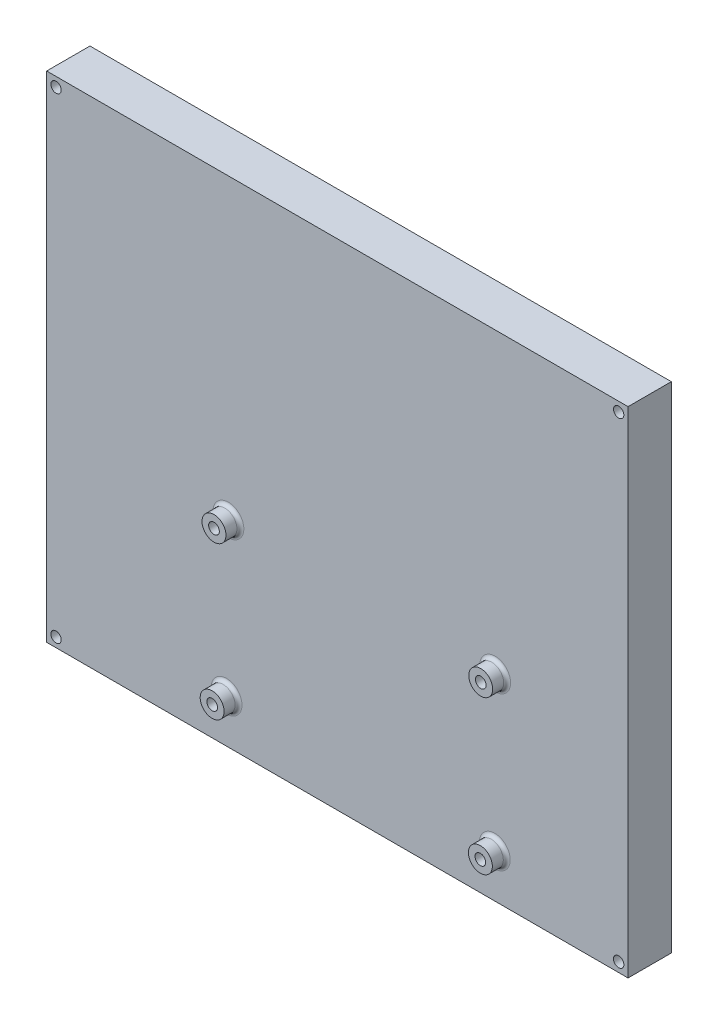
ISO-10303-21;
HEADER;
FILE_DESCRIPTION(('STEP AP214'),'2;1');
FILE_NAME('part.step','',(''),(''),'','','');
FILE_SCHEMA(('AUTOMOTIVE_DESIGN { 1 0 10303 214 1 1 1 1 }'));
ENDSEC;
DATA;
#1=APPLICATION_CONTEXT('core data for automotive mechanical design processes');
#2=APPLICATION_PROTOCOL_DEFINITION('international standard','automotive_design',2000,#1);
#3=PRODUCT_CONTEXT('',#1,'mechanical');
#4=PRODUCT('Part','Part','',(#3));
#5=PRODUCT_RELATED_PRODUCT_CATEGORY('part','',(#4));
#6=PRODUCT_DEFINITION_FORMATION('','',#4);
#7=PRODUCT_DEFINITION_CONTEXT('part definition',#1,'design');
#8=PRODUCT_DEFINITION('design','',#6,#7);
#9=PRODUCT_DEFINITION_SHAPE('','',#8);
#10=(LENGTH_UNIT() NAMED_UNIT(*) SI_UNIT(.MILLI.,.METRE.));
#11=(NAMED_UNIT(*) PLANE_ANGLE_UNIT() SI_UNIT($,.RADIAN.));
#12=(NAMED_UNIT(*) SI_UNIT($,.STERADIAN.) SOLID_ANGLE_UNIT());
#13=UNCERTAINTY_MEASURE_WITH_UNIT(LENGTH_MEASURE(1.E-05),#10,'distance_accuracy_value','');
#14=(GEOMETRIC_REPRESENTATION_CONTEXT(3) GLOBAL_UNCERTAINTY_ASSIGNED_CONTEXT((#13)) GLOBAL_UNIT_ASSIGNED_CONTEXT((#10,
#11,#12)) REPRESENTATION_CONTEXT('',''));
#15=CARTESIAN_POINT('',(0.,0.,0.));
#16=DIRECTION('',(0.,0.,1.));
#17=DIRECTION('',(1.,0.,0.));
#18=AXIS2_PLACEMENT_3D('',#15,#16,#17);
#19=CARTESIAN_POINT('',(100.75,85.75,15.));
#20=DIRECTION('',(-1.,0.,0.));
#21=DIRECTION('',(0.,-1.,0.));
#22=AXIS2_PLACEMENT_3D('',#19,#20,#21);
#23=PLANE('',#22);
#24=DIRECTION('',(0.,1.,0.));
#25=VECTOR('',#24,1.);
#26=CARTESIAN_POINT('',(100.75,85.75,0.));
#27=LINE('',#26,#25);
#28=CARTESIAN_POINT('',(100.75,-85.75,0.));
#29=VERTEX_POINT('',#28);
#30=CARTESIAN_POINT('',(100.75,85.75,0.));
#31=VERTEX_POINT('',#30);
#32=EDGE_CURVE('E266',#29,#31,#27,.T.);
#33=ORIENTED_EDGE('',*,*,#32,.T.);
#34=DIRECTION('',(0.,0.,-1.));
#35=VECTOR('',#34,1.);
#36=CARTESIAN_POINT('',(100.75,85.75,15.));
#37=LINE('',#36,#35);
#38=CARTESIAN_POINT('',(100.75,85.75,15.));
#39=VERTEX_POINT('',#38);
#40=EDGE_CURVE('E301',#39,#31,#37,.T.);
#41=ORIENTED_EDGE('',*,*,#40,.F.);
#42=DIRECTION('',(0.,1.,0.));
#43=VECTOR('',#42,1.);
#44=CARTESIAN_POINT('',(100.75,85.75,15.));
#45=LINE('',#44,#43);
#46=CARTESIAN_POINT('',(100.75,-85.75,15.));
#47=VERTEX_POINT('',#46);
#48=EDGE_CURVE('E270',#47,#39,#45,.T.);
#49=ORIENTED_EDGE('',*,*,#48,.F.);
#50=DIRECTION('',(0.,0.,-1.));
#51=VECTOR('',#50,1.);
#52=CARTESIAN_POINT('',(100.75,-85.75,15.));
#53=LINE('',#52,#51);
#54=EDGE_CURVE('E280',#47,#29,#53,.T.);
#55=ORIENTED_EDGE('',*,*,#54,.T.);
#56=EDGE_LOOP('',(#33,#41,#49,#55));
#57=FACE_BOUND('',#56,.T.);
#58=ADVANCED_FACE('F75',(#57),#23,.F.);
#59=CARTESIAN_POINT('',(-100.75,85.75,15.));
#60=DIRECTION('',(0.,-1.,0.));
#61=DIRECTION('',(0.,0.,-1.));
#62=AXIS2_PLACEMENT_3D('',#59,#60,#61);
#63=PLANE('',#62);
#64=DIRECTION('',(-1.,0.,0.));
#65=VECTOR('',#64,1.);
#66=CARTESIAN_POINT('',(-100.75,85.75,0.));
#67=LINE('',#66,#65);
#68=CARTESIAN_POINT('',(-100.75,85.75,0.));
#69=VERTEX_POINT('',#68);
#70=EDGE_CURVE('E284',#31,#69,#67,.T.);
#71=ORIENTED_EDGE('',*,*,#70,.T.);
#72=DIRECTION('',(0.,0.,-1.));
#73=VECTOR('',#72,1.);
#74=CARTESIAN_POINT('',(-100.75,85.75,15.));
#75=LINE('',#74,#73);
#76=CARTESIAN_POINT('',(-100.75,85.75,15.));
#77=VERTEX_POINT('',#76);
#78=EDGE_CURVE('E297',#77,#69,#75,.T.);
#79=ORIENTED_EDGE('',*,*,#78,.F.);
#80=DIRECTION('',(-1.,0.,0.));
#81=VECTOR('',#80,1.);
#82=CARTESIAN_POINT('',(-100.75,85.75,15.));
#83=LINE('',#82,#81);
#84=EDGE_CURVE('E129',#39,#77,#83,.T.);
#85=ORIENTED_EDGE('',*,*,#84,.F.);
#86=ORIENTED_EDGE('',*,*,#40,.T.);
#87=EDGE_LOOP('',(#71,#79,#85,#86));
#88=FACE_BOUND('',#87,.T.);
#89=ADVANCED_FACE('F349',(#88),#63,.F.);
#90=CARTESIAN_POINT('',(-100.75,85.75,15.));
#91=DIRECTION('',(1.,0.,0.));
#92=DIRECTION('',(0.,1.,0.));
#93=AXIS2_PLACEMENT_3D('',#90,#91,#92);
#94=PLANE('',#93);
#95=DIRECTION('',(0.,-1.,0.));
#96=VECTOR('',#95,1.);
#97=CARTESIAN_POINT('',(-100.75,85.75,0.));
#98=LINE('',#97,#96);
#99=CARTESIAN_POINT('',(-100.75,-85.75,0.));
#100=VERTEX_POINT('',#99);
#101=EDGE_CURVE('E287',#69,#100,#98,.T.);
#102=ORIENTED_EDGE('',*,*,#101,.T.);
#103=DIRECTION('',(0.,0.,-1.));
#104=VECTOR('',#103,1.);
#105=CARTESIAN_POINT('',(-100.75,-85.75,15.));
#106=LINE('',#105,#104);
#107=CARTESIAN_POINT('',(-100.75,-85.75,15.));
#108=VERTEX_POINT('',#107);
#109=EDGE_CURVE('E294',#108,#100,#106,.T.);
#110=ORIENTED_EDGE('',*,*,#109,.F.);
#111=DIRECTION('',(0.,-1.,0.));
#112=VECTOR('',#111,1.);
#113=CARTESIAN_POINT('',(-100.75,85.75,15.));
#114=LINE('',#113,#112);
#115=EDGE_CURVE('E275',#77,#108,#114,.T.);
#116=ORIENTED_EDGE('',*,*,#115,.F.);
#117=ORIENTED_EDGE('',*,*,#78,.T.);
#118=EDGE_LOOP('',(#102,#110,#116,#117));
#119=FACE_BOUND('',#118,.T.);
#120=ADVANCED_FACE('F354',(#119),#94,.F.);
#121=CARTESIAN_POINT('',(-100.75,-85.75,15.));
#122=DIRECTION('',(0.,1.,0.));
#123=DIRECTION('',(0.,0.,1.));
#124=AXIS2_PLACEMENT_3D('',#121,#122,#123);
#125=PLANE('',#124);
#126=DIRECTION('',(1.,0.,0.));
#127=VECTOR('',#126,1.);
#128=CARTESIAN_POINT('',(-100.75,-85.75,0.));
#129=LINE('',#128,#127);
#130=EDGE_CURVE('E121',#100,#29,#129,.T.);
#131=ORIENTED_EDGE('',*,*,#130,.T.);
#132=ORIENTED_EDGE('',*,*,#54,.F.);
#133=DIRECTION('',(1.,0.,0.));
#134=VECTOR('',#133,1.);
#135=CARTESIAN_POINT('',(-100.75,-85.75,15.));
#136=LINE('',#135,#134);
#137=EDGE_CURVE('E100',#108,#47,#136,.T.);
#138=ORIENTED_EDGE('',*,*,#137,.F.);
#139=ORIENTED_EDGE('',*,*,#109,.T.);
#140=EDGE_LOOP('',(#131,#132,#138,#139));
#141=FACE_BOUND('',#140,.T.);
#142=ADVANCED_FACE('F458',(#141),#125,.F.);
#143=CARTESIAN_POINT('',(0.,0.,15.));
#144=DIRECTION('',(0.,0.,1.));
#145=DIRECTION('',(1.,0.,0.));
#146=AXIS2_PLACEMENT_3D('',#143,#144,#145);
#147=PLANE('',#146);
#148=CARTESIAN_POINT('',(-38.3989992,-70.7475021000001,15.));
#149=DIRECTION('',(0.,0.,1.));
#150=DIRECTION('',(1.,0.,0.));
#151=AXIS2_PLACEMENT_3D('',#148,#149,#150);
#152=CIRCLE('',#151,5.35);
#153=CARTESIAN_POINT('',(-33.0489992,-70.7475021000001,15.));
#154=VERTEX_POINT('',#153);
#155=EDGE_CURVE('E320',#154,#154,#152,.F.);
#156=ORIENTED_EDGE('',*,*,#155,.T.);
#157=EDGE_LOOP('',(#156));
#158=FACE_BOUND('',#157,.T.);
#159=CARTESIAN_POINT('',(54.5650008,-70.7475021000001,15.));
#160=DIRECTION('',(0.,0.,1.));
#161=DIRECTION('',(1.,0.,0.));
#162=AXIS2_PLACEMENT_3D('',#159,#160,#161);
#163=CIRCLE('',#162,5.35);
#164=CARTESIAN_POINT('',(59.9150008,-70.7475021000001,15.));
#165=VERTEX_POINT('',#164);
#166=EDGE_CURVE('E316',#165,#165,#163,.F.);
#167=ORIENTED_EDGE('',*,*,#166,.T.);
#168=EDGE_LOOP('',(#167));
#169=FACE_BOUND('',#168,.T.);
#170=CARTESIAN_POINT('',(54.6920008,-17.5345021000001,15.));
#171=DIRECTION('',(0.,0.,1.));
#172=DIRECTION('',(1.,0.,0.));
#173=AXIS2_PLACEMENT_3D('',#170,#171,#172);
#174=CIRCLE('',#173,5.35);
#175=CARTESIAN_POINT('',(60.0420008,-17.5345021000001,15.));
#176=VERTEX_POINT('',#175);
#177=EDGE_CURVE('E312',#176,#176,#174,.F.);
#178=ORIENTED_EDGE('',*,*,#177,.T.);
#179=EDGE_LOOP('',(#178));
#180=FACE_BOUND('',#179,.T.);
#181=CARTESIAN_POINT('',(-37.7639992,-17.5345021000001,15.));
#182=DIRECTION('',(0.,0.,1.));
#183=DIRECTION('',(1.,0.,0.));
#184=AXIS2_PLACEMENT_3D('',#181,#182,#183);
#185=CIRCLE('',#184,5.35);
#186=CARTESIAN_POINT('',(-32.4139992,-17.5345021000001,15.));
#187=VERTEX_POINT('',#186);
#188=EDGE_CURVE('E308',#187,#187,#185,.F.);
#189=ORIENTED_EDGE('',*,*,#188,.T.);
#190=EDGE_LOOP('',(#189));
#191=FACE_BOUND('',#190,.T.);
#192=CARTESIAN_POINT('',(97.5,-82.5,15.));
#193=DIRECTION('',(0.,0.,1.));
#194=DIRECTION('',(1.,0.,0.));
#195=AXIS2_PLACEMENT_3D('',#192,#193,#194);
#196=CIRCLE('',#195,1.79999999999999);
#197=CARTESIAN_POINT('',(99.3,-82.5,15.));
#198=VERTEX_POINT('',#197);
#199=EDGE_CURVE('E255',#198,#198,#196,.T.);
#200=ORIENTED_EDGE('',*,*,#199,.F.);
#201=EDGE_LOOP('',(#200));
#202=FACE_BOUND('',#201,.T.);
#203=CARTESIAN_POINT('',(-97.5,-82.5,15.));
#204=DIRECTION('',(0.,0.,1.));
#205=DIRECTION('',(1.,0.,0.));
#206=AXIS2_PLACEMENT_3D('',#203,#204,#205);
#207=CIRCLE('',#206,1.79999999999999);
#208=CARTESIAN_POINT('',(-95.7,-82.5,15.));
#209=VERTEX_POINT('',#208);
#210=EDGE_CURVE('E247',#209,#209,#207,.T.);
#211=ORIENTED_EDGE('',*,*,#210,.F.);
#212=EDGE_LOOP('',(#211));
#213=FACE_BOUND('',#212,.T.);
#214=CARTESIAN_POINT('',(-97.5,82.5,15.));
#215=DIRECTION('',(0.,0.,1.));
#216=DIRECTION('',(1.,0.,0.));
#217=AXIS2_PLACEMENT_3D('',#214,#215,#216);
#218=CIRCLE('',#217,1.79999999999999);
#219=CARTESIAN_POINT('',(-95.7,82.5,15.));
#220=VERTEX_POINT('',#219);
#221=EDGE_CURVE('E238',#220,#220,#218,.T.);
#222=ORIENTED_EDGE('',*,*,#221,.F.);
#223=EDGE_LOOP('',(#222));
#224=FACE_BOUND('',#223,.T.);
#225=CARTESIAN_POINT('',(97.5,82.5,15.));
#226=DIRECTION('',(0.,0.,1.));
#227=DIRECTION('',(1.,0.,0.));
#228=AXIS2_PLACEMENT_3D('',#225,#226,#227);
#229=CIRCLE('',#228,1.79999999999999);
#230=CARTESIAN_POINT('',(99.3,82.5,15.));
#231=VERTEX_POINT('',#230);
#232=EDGE_CURVE('E242',#231,#231,#229,.T.);
#233=ORIENTED_EDGE('',*,*,#232,.F.);
#234=EDGE_LOOP('',(#233));
#235=FACE_BOUND('',#234,.T.);
#236=ORIENTED_EDGE('',*,*,#48,.T.);
#237=ORIENTED_EDGE('',*,*,#84,.T.);
#238=ORIENTED_EDGE('',*,*,#115,.T.);
#239=ORIENTED_EDGE('',*,*,#137,.T.);
#240=EDGE_LOOP('',(#236,#237,#238,#239));
#241=FACE_BOUND('',#240,.T.);
#242=ADVANCED_FACE('F455',(#158,#169,#180,#191,#202,#213,#224,#235,#241),#147,.T.);
#243=CARTESIAN_POINT('',(0.,0.,0.));
#244=DIRECTION('',(0.,0.,1.));
#245=DIRECTION('',(1.,0.,0.));
#246=AXIS2_PLACEMENT_3D('',#243,#244,#245);
#247=PLANE('',#246);
#248=DIRECTION('',(1.,0.,0.));
#249=VECTOR('',#248,1.);
#250=CARTESIAN_POINT('',(90.,75.,0.));
#251=LINE('',#250,#249);
#252=CARTESIAN_POINT('',(-90.,75.,0.));
#253=VERTEX_POINT('',#252);
#254=CARTESIAN_POINT('',(90.,75.,0.));
#255=VERTEX_POINT('',#254);
#256=EDGE_CURVE('E191',#253,#255,#251,.T.);
#257=ORIENTED_EDGE('',*,*,#256,.F.);
#258=DIRECTION('',(0.,1.,0.));
#259=VECTOR('',#258,1.);
#260=CARTESIAN_POINT('',(-90.,75.,0.));
#261=LINE('',#260,#259);
#262=CARTESIAN_POINT('',(-90.,-75.,0.));
#263=VERTEX_POINT('',#262);
#264=EDGE_CURVE('E91',#263,#253,#261,.T.);
#265=ORIENTED_EDGE('',*,*,#264,.F.);
#266=DIRECTION('',(-1.,0.,0.));
#267=VECTOR('',#266,1.);
#268=CARTESIAN_POINT('',(90.,-75.,0.));
#269=LINE('',#268,#267);
#270=CARTESIAN_POINT('',(90.,-75.,0.));
#271=VERTEX_POINT('',#270);
#272=EDGE_CURVE('E174',#271,#263,#269,.T.);
#273=ORIENTED_EDGE('',*,*,#272,.F.);
#274=DIRECTION('',(0.,-1.,0.));
#275=VECTOR('',#274,1.);
#276=CARTESIAN_POINT('',(90.,75.,0.));
#277=LINE('',#276,#275);
#278=EDGE_CURVE('E179',#255,#271,#277,.T.);
#279=ORIENTED_EDGE('',*,*,#278,.F.);
#280=EDGE_LOOP('',(#257,#265,#273,#279));
#281=FACE_BOUND('',#280,.T.);
#282=CARTESIAN_POINT('',(97.5,-82.5,0.));
#283=DIRECTION('',(0.,0.,1.));
#284=DIRECTION('',(1.,0.,0.));
#285=AXIS2_PLACEMENT_3D('',#282,#283,#284);
#286=CIRCLE('',#285,1.79999999999999);
#287=CARTESIAN_POINT('',(99.3,-82.5,0.));
#288=VERTEX_POINT('',#287);
#289=EDGE_CURVE('E237',#288,#288,#286,.T.);
#290=ORIENTED_EDGE('',*,*,#289,.T.);
#291=EDGE_LOOP('',(#290));
#292=FACE_BOUND('',#291,.T.);
#293=CARTESIAN_POINT('',(-97.5,-82.5,0.));
#294=DIRECTION('',(0.,0.,1.));
#295=DIRECTION('',(1.,0.,0.));
#296=AXIS2_PLACEMENT_3D('',#293,#294,#295);
#297=CIRCLE('',#296,1.79999999999999);
#298=CARTESIAN_POINT('',(-95.7,-82.5,0.));
#299=VERTEX_POINT('',#298);
#300=EDGE_CURVE('E251',#299,#299,#297,.T.);
#301=ORIENTED_EDGE('',*,*,#300,.T.);
#302=EDGE_LOOP('',(#301));
#303=FACE_BOUND('',#302,.T.);
#304=CARTESIAN_POINT('',(-97.5,82.5,0.));
#305=DIRECTION('',(0.,0.,1.));
#306=DIRECTION('',(1.,0.,0.));
#307=AXIS2_PLACEMENT_3D('',#304,#305,#306);
#308=CIRCLE('',#307,1.79999999999999);
#309=CARTESIAN_POINT('',(-95.7,82.5,0.));
#310=VERTEX_POINT('',#309);
#311=EDGE_CURVE('E243',#310,#310,#308,.T.);
#312=ORIENTED_EDGE('',*,*,#311,.T.);
#313=EDGE_LOOP('',(#312));
#314=FACE_BOUND('',#313,.T.);
#315=CARTESIAN_POINT('',(97.5,82.5,0.));
#316=DIRECTION('',(0.,0.,1.));
#317=DIRECTION('',(1.,0.,0.));
#318=AXIS2_PLACEMENT_3D('',#315,#316,#317);
#319=CIRCLE('',#318,1.79999999999999);
#320=CARTESIAN_POINT('',(99.3,82.5,0.));
#321=VERTEX_POINT('',#320);
#322=EDGE_CURVE('E262',#321,#321,#319,.T.);
#323=ORIENTED_EDGE('',*,*,#322,.T.);
#324=EDGE_LOOP('',(#323));
#325=FACE_BOUND('',#324,.T.);
#326=ORIENTED_EDGE('',*,*,#32,.F.);
#327=ORIENTED_EDGE('',*,*,#130,.F.);
#328=ORIENTED_EDGE('',*,*,#101,.F.);
#329=ORIENTED_EDGE('',*,*,#70,.F.);
#330=EDGE_LOOP('',(#326,#327,#328,#329));
#331=FACE_BOUND('',#330,.T.);
#332=ADVANCED_FACE('F453',(#281,#292,#303,#314,#325,#331),#247,.F.);
#333=CARTESIAN_POINT('',(97.5,82.5,0.));
#334=DIRECTION('',(0.,0.,1.));
#335=DIRECTION('',(1.,0.,0.));
#336=AXIS2_PLACEMENT_3D('',#333,#334,#335);
#337=CYLINDRICAL_SURFACE('',#336,1.79999999999999);
#338=ORIENTED_EDGE('',*,*,#322,.F.);
#339=EDGE_LOOP('',(#338));
#340=FACE_BOUND('',#339,.T.);
#341=ORIENTED_EDGE('',*,*,#232,.T.);
#342=EDGE_LOOP('',(#341));
#343=FACE_BOUND('',#342,.T.);
#344=ADVANCED_FACE('F443',(#340,#343),#337,.F.);
#345=CARTESIAN_POINT('',(-97.5,82.5,0.));
#346=DIRECTION('',(0.,0.,1.));
#347=DIRECTION('',(1.,0.,0.));
#348=AXIS2_PLACEMENT_3D('',#345,#346,#347);
#349=CYLINDRICAL_SURFACE('',#348,1.79999999999999);
#350=ORIENTED_EDGE('',*,*,#311,.F.);
#351=EDGE_LOOP('',(#350));
#352=FACE_BOUND('',#351,.T.);
#353=ORIENTED_EDGE('',*,*,#221,.T.);
#354=EDGE_LOOP('',(#353));
#355=FACE_BOUND('',#354,.T.);
#356=ADVANCED_FACE('F439',(#352,#355),#349,.F.);
#357=CARTESIAN_POINT('',(-97.5,-82.5,0.));
#358=DIRECTION('',(0.,0.,1.));
#359=DIRECTION('',(1.,0.,0.));
#360=AXIS2_PLACEMENT_3D('',#357,#358,#359);
#361=CYLINDRICAL_SURFACE('',#360,1.79999999999999);
#362=ORIENTED_EDGE('',*,*,#300,.F.);
#363=EDGE_LOOP('',(#362));
#364=FACE_BOUND('',#363,.T.);
#365=ORIENTED_EDGE('',*,*,#210,.T.);
#366=EDGE_LOOP('',(#365));
#367=FACE_BOUND('',#366,.T.);
#368=ADVANCED_FACE('F442',(#364,#367),#361,.F.);
#369=CARTESIAN_POINT('',(97.5,-82.5,0.));
#370=DIRECTION('',(0.,0.,1.));
#371=DIRECTION('',(1.,0.,0.));
#372=AXIS2_PLACEMENT_3D('',#369,#370,#371);
#373=CYLINDRICAL_SURFACE('',#372,1.79999999999999);
#374=ORIENTED_EDGE('',*,*,#289,.F.);
#375=EDGE_LOOP('',(#374));
#376=FACE_BOUND('',#375,.T.);
#377=ORIENTED_EDGE('',*,*,#199,.T.);
#378=EDGE_LOOP('',(#377));
#379=FACE_BOUND('',#378,.T.);
#380=ADVANCED_FACE('F434',(#376,#379),#373,.F.);
#381=CARTESIAN_POINT('',(-37.7639992,-17.5345021000001,20.));
#382=DIRECTION('',(0.,0.,1.));
#383=DIRECTION('',(1.,0.,0.));
#384=AXIS2_PLACEMENT_3D('',#381,#382,#383);
#385=PLANE('',#384);
#386=CARTESIAN_POINT('',(-37.7639992,-17.5345021000001,20.));
#387=DIRECTION('',(0.,0.,1.));
#388=DIRECTION('',(1.,0.,0.));
#389=AXIS2_PLACEMENT_3D('',#386,#387,#388);
#390=CIRCLE('',#389,4.15);
#391=CARTESIAN_POINT('',(-33.6139992,-17.5345021000001,20.));
#392=VERTEX_POINT('',#391);
#393=EDGE_CURVE('E233',#392,#392,#390,.T.);
#394=ORIENTED_EDGE('',*,*,#393,.T.);
#395=EDGE_LOOP('',(#394));
#396=FACE_BOUND('',#395,.T.);
#397=CARTESIAN_POINT('',(-37.7639992,-17.5345021000001,20.));
#398=DIRECTION('',(0.,0.,1.));
#399=DIRECTION('',(1.,0.,0.));
#400=AXIS2_PLACEMENT_3D('',#397,#398,#399);
#401=CIRCLE('',#400,1.85);
#402=CARTESIAN_POINT('',(-35.9139992,-17.5345021000001,20.));
#403=VERTEX_POINT('',#402);
#404=EDGE_CURVE('E215',#403,#403,#401,.T.);
#405=ORIENTED_EDGE('',*,*,#404,.F.);
#406=EDGE_LOOP('',(#405));
#407=FACE_BOUND('',#406,.T.);
#408=ADVANCED_FACE('F431',(#396,#407),#385,.T.);
#409=CARTESIAN_POINT('',(-37.7639992,-17.5345021000001,20.));
#410=DIRECTION('',(0.,0.,-1.));
#411=DIRECTION('',(-1.,0.,0.));
#412=AXIS2_PLACEMENT_3D('',#409,#410,#411);
#413=CYLINDRICAL_SURFACE('',#412,4.15);
#414=CARTESIAN_POINT('',(-37.7639992,-17.5345021000001,16.2));
#415=DIRECTION('',(0.,0.,1.));
#416=DIRECTION('',(1.,0.,0.));
#417=AXIS2_PLACEMENT_3D('',#414,#415,#416);
#418=CIRCLE('',#417,4.15);
#419=CARTESIAN_POINT('',(-33.6139992,-17.5345021000001,16.2));
#420=VERTEX_POINT('',#419);
#421=EDGE_CURVE('E12',#420,#420,#418,.T.);
#422=ORIENTED_EDGE('',*,*,#421,.T.);
#423=EDGE_LOOP('',(#422));
#424=FACE_BOUND('',#423,.T.);
#425=ORIENTED_EDGE('',*,*,#393,.F.);
#426=EDGE_LOOP('',(#425));
#427=FACE_BOUND('',#426,.T.);
#428=ADVANCED_FACE('F429',(#424,#427),#413,.T.);
#429=CARTESIAN_POINT('',(-37.7639992,-17.5345021000001,20.));
#430=DIRECTION('',(0.,0.,-1.));
#431=DIRECTION('',(-1.,0.,0.));
#432=AXIS2_PLACEMENT_3D('',#429,#430,#431);
#433=CYLINDRICAL_SURFACE('',#432,1.85);
#434=ORIENTED_EDGE('',*,*,#404,.T.);
#435=EDGE_LOOP('',(#434));
#436=FACE_BOUND('',#435,.T.);
#437=CARTESIAN_POINT('',(-37.7639992,-17.5345021000001,13.));
#438=DIRECTION('',(0.,0.,1.));
#439=DIRECTION('',(1.,0.,0.));
#440=AXIS2_PLACEMENT_3D('',#437,#438,#439);
#441=CIRCLE('',#440,1.85);
#442=CARTESIAN_POINT('',(-35.9139992,-17.5345021000001,13.));
#443=VERTEX_POINT('',#442);
#444=EDGE_CURVE('E182',#443,#443,#441,.T.);
#445=ORIENTED_EDGE('',*,*,#444,.F.);
#446=EDGE_LOOP('',(#445));
#447=FACE_BOUND('',#446,.T.);
#448=ADVANCED_FACE('F426',(#436,#447),#433,.F.);
#449=CARTESIAN_POINT('',(54.6920008,-17.5345021000001,20.));
#450=DIRECTION('',(0.,0.,1.));
#451=DIRECTION('',(1.,0.,0.));
#452=AXIS2_PLACEMENT_3D('',#449,#450,#451);
#453=PLANE('',#452);
#454=CARTESIAN_POINT('',(54.6920008,-17.5345021000001,20.));
#455=DIRECTION('',(0.,0.,1.));
#456=DIRECTION('',(1.,0.,0.));
#457=AXIS2_PLACEMENT_3D('',#454,#455,#456);
#458=CIRCLE('',#457,4.15);
#459=CARTESIAN_POINT('',(58.8420008,-17.5345021000001,20.));
#460=VERTEX_POINT('',#459);
#461=EDGE_CURVE('E206',#460,#460,#458,.T.);
#462=ORIENTED_EDGE('',*,*,#461,.T.);
#463=EDGE_LOOP('',(#462));
#464=FACE_BOUND('',#463,.T.);
#465=CARTESIAN_POINT('',(54.6920008,-17.5345021000001,20.));
#466=DIRECTION('',(0.,0.,1.));
#467=DIRECTION('',(1.,0.,0.));
#468=AXIS2_PLACEMENT_3D('',#465,#466,#467);
#469=CIRCLE('',#468,1.85);
#470=CARTESIAN_POINT('',(56.5420008,-17.5345021000001,20.));
#471=VERTEX_POINT('',#470);
#472=EDGE_CURVE('E210',#471,#471,#469,.T.);
#473=ORIENTED_EDGE('',*,*,#472,.F.);
#474=EDGE_LOOP('',(#473));
#475=FACE_BOUND('',#474,.T.);
#476=ADVANCED_FACE('F416',(#464,#475),#453,.T.);
#477=CARTESIAN_POINT('',(54.6920008,-17.5345021000001,20.));
#478=DIRECTION('',(0.,0.,-1.));
#479=DIRECTION('',(-1.,0.,0.));
#480=AXIS2_PLACEMENT_3D('',#477,#478,#479);
#481=CYLINDRICAL_SURFACE('',#480,4.15);
#482=CARTESIAN_POINT('',(54.6920008,-17.5345021000001,16.2));
#483=DIRECTION('',(0.,0.,1.));
#484=DIRECTION('',(1.,0.,0.));
#485=AXIS2_PLACEMENT_3D('',#482,#483,#484);
#486=CIRCLE('',#485,4.15);
#487=CARTESIAN_POINT('',(58.8420008,-17.5345021000001,16.2));
#488=VERTEX_POINT('',#487);
#489=EDGE_CURVE('E84',#488,#488,#486,.T.);
#490=ORIENTED_EDGE('',*,*,#489,.T.);
#491=EDGE_LOOP('',(#490));
#492=FACE_BOUND('',#491,.T.);
#493=ORIENTED_EDGE('',*,*,#461,.F.);
#494=EDGE_LOOP('',(#493));
#495=FACE_BOUND('',#494,.T.);
#496=ADVANCED_FACE('F332',(#492,#495),#481,.T.);
#497=CARTESIAN_POINT('',(54.6920008,-17.5345021000001,20.));
#498=DIRECTION('',(0.,0.,-1.));
#499=DIRECTION('',(-1.,0.,0.));
#500=AXIS2_PLACEMENT_3D('',#497,#498,#499);
#501=CYLINDRICAL_SURFACE('',#500,1.85);
#502=ORIENTED_EDGE('',*,*,#472,.T.);
#503=EDGE_LOOP('',(#502));
#504=FACE_BOUND('',#503,.T.);
#505=CARTESIAN_POINT('',(54.6920008,-17.5345021000001,13.));
#506=DIRECTION('',(0.,0.,1.));
#507=DIRECTION('',(1.,0.,0.));
#508=AXIS2_PLACEMENT_3D('',#505,#506,#507);
#509=CIRCLE('',#508,1.85);
#510=CARTESIAN_POINT('',(56.5420008,-17.5345021000001,13.));
#511=VERTEX_POINT('',#510);
#512=EDGE_CURVE('E396',#511,#511,#509,.T.);
#513=ORIENTED_EDGE('',*,*,#512,.F.);
#514=EDGE_LOOP('',(#513));
#515=FACE_BOUND('',#514,.T.);
#516=ADVANCED_FACE('F405',(#504,#515),#501,.F.);
#517=CARTESIAN_POINT('',(54.5650008,-70.7475021000001,20.));
#518=DIRECTION('',(0.,0.,1.));
#519=DIRECTION('',(1.,0.,0.));
#520=AXIS2_PLACEMENT_3D('',#517,#518,#519);
#521=PLANE('',#520);
#522=CARTESIAN_POINT('',(54.5650008,-70.7475021000001,20.));
#523=DIRECTION('',(0.,0.,1.));
#524=DIRECTION('',(1.,0.,0.));
#525=AXIS2_PLACEMENT_3D('',#522,#523,#524);
#526=CIRCLE('',#525,4.15);
#527=CARTESIAN_POINT('',(58.7150008,-70.7475021000001,20.));
#528=VERTEX_POINT('',#527);
#529=EDGE_CURVE('E216',#528,#528,#526,.T.);
#530=ORIENTED_EDGE('',*,*,#529,.T.);
#531=EDGE_LOOP('',(#530));
#532=FACE_BOUND('',#531,.T.);
#533=CARTESIAN_POINT('',(54.5650008,-70.7475021000001,20.));
#534=DIRECTION('',(0.,0.,1.));
#535=DIRECTION('',(1.,0.,0.));
#536=AXIS2_PLACEMENT_3D('',#533,#534,#535);
#537=CIRCLE('',#536,1.85);
#538=CARTESIAN_POINT('',(56.4150008,-70.7475021000001,20.));
#539=VERTEX_POINT('',#538);
#540=EDGE_CURVE('E211',#539,#539,#537,.T.);
#541=ORIENTED_EDGE('',*,*,#540,.F.);
#542=EDGE_LOOP('',(#541));
#543=FACE_BOUND('',#542,.T.);
#544=ADVANCED_FACE('F407',(#532,#543),#521,.T.);
#545=CARTESIAN_POINT('',(54.5650008,-70.7475021000001,20.));
#546=DIRECTION('',(0.,0.,-1.));
#547=DIRECTION('',(-1.,0.,0.));
#548=AXIS2_PLACEMENT_3D('',#545,#546,#547);
#549=CYLINDRICAL_SURFACE('',#548,4.15);
#550=CARTESIAN_POINT('',(54.5650008,-70.7475021000001,16.2));
#551=DIRECTION('',(0.,0.,1.));
#552=DIRECTION('',(1.,0.,0.));
#553=AXIS2_PLACEMENT_3D('',#550,#551,#552);
#554=CIRCLE('',#553,4.15);
#555=CARTESIAN_POINT('',(58.7150008,-70.7475021000001,16.2));
#556=VERTEX_POINT('',#555);
#557=EDGE_CURVE('E324',#556,#556,#554,.T.);
#558=ORIENTED_EDGE('',*,*,#557,.T.);
#559=EDGE_LOOP('',(#558));
#560=FACE_BOUND('',#559,.T.);
#561=ORIENTED_EDGE('',*,*,#529,.F.);
#562=EDGE_LOOP('',(#561));
#563=FACE_BOUND('',#562,.T.);
#564=ADVANCED_FACE('F413',(#560,#563),#549,.T.);
#565=CARTESIAN_POINT('',(54.5650008,-70.7475021000001,20.));
#566=DIRECTION('',(0.,0.,-1.));
#567=DIRECTION('',(-1.,0.,0.));
#568=AXIS2_PLACEMENT_3D('',#565,#566,#567);
#569=CYLINDRICAL_SURFACE('',#568,1.85);
#570=ORIENTED_EDGE('',*,*,#540,.T.);
#571=EDGE_LOOP('',(#570));
#572=FACE_BOUND('',#571,.T.);
#573=CARTESIAN_POINT('',(54.5650008,-70.7475021000001,13.));
#574=DIRECTION('',(0.,0.,1.));
#575=DIRECTION('',(1.,0.,0.));
#576=AXIS2_PLACEMENT_3D('',#573,#574,#575);
#577=CIRCLE('',#576,1.84999999999999);
#578=CARTESIAN_POINT('',(56.4150008,-70.7475021000001,13.));
#579=VERTEX_POINT('',#578);
#580=EDGE_CURVE('E389',#579,#579,#577,.T.);
#581=ORIENTED_EDGE('',*,*,#580,.F.);
#582=EDGE_LOOP('',(#581));
#583=FACE_BOUND('',#582,.T.);
#584=ADVANCED_FACE('F377',(#572,#583),#569,.F.);
#585=CARTESIAN_POINT('',(-38.3989992,-70.7475021000001,20.));
#586=DIRECTION('',(0.,0.,1.));
#587=DIRECTION('',(1.,0.,0.));
#588=AXIS2_PLACEMENT_3D('',#585,#586,#587);
#589=PLANE('',#588);
#590=CARTESIAN_POINT('',(-38.3989992,-70.7475021000001,20.));
#591=DIRECTION('',(0.,0.,1.));
#592=DIRECTION('',(1.,0.,0.));
#593=AXIS2_PLACEMENT_3D('',#590,#591,#592);
#594=CIRCLE('',#593,4.15);
#595=CARTESIAN_POINT('',(-34.2489992,-70.7475021000001,20.));
#596=VERTEX_POINT('',#595);
#597=EDGE_CURVE('E200',#596,#596,#594,.T.);
#598=ORIENTED_EDGE('',*,*,#597,.T.);
#599=EDGE_LOOP('',(#598));
#600=FACE_BOUND('',#599,.T.);
#601=CARTESIAN_POINT('',(-38.3989992,-70.7475021000001,20.));
#602=DIRECTION('',(0.,0.,1.));
#603=DIRECTION('',(1.,0.,0.));
#604=AXIS2_PLACEMENT_3D('',#601,#602,#603);
#605=CIRCLE('',#604,1.85);
#606=CARTESIAN_POINT('',(-36.5489992,-70.7475021000001,20.));
#607=VERTEX_POINT('',#606);
#608=EDGE_CURVE('E220',#607,#607,#605,.T.);
#609=ORIENTED_EDGE('',*,*,#608,.F.);
#610=EDGE_LOOP('',(#609));
#611=FACE_BOUND('',#610,.T.);
#612=ADVANCED_FACE('F371',(#600,#611),#589,.T.);
#613=CARTESIAN_POINT('',(-38.3989992,-70.7475021000001,20.));
#614=DIRECTION('',(0.,0.,-1.));
#615=DIRECTION('',(-1.,0.,0.));
#616=AXIS2_PLACEMENT_3D('',#613,#614,#615);
#617=CYLINDRICAL_SURFACE('',#616,4.15);
#618=CARTESIAN_POINT('',(-38.3989992,-70.7475021000001,16.2));
#619=DIRECTION('',(0.,0.,1.));
#620=DIRECTION('',(1.,0.,0.));
#621=AXIS2_PLACEMENT_3D('',#618,#619,#620);
#622=CIRCLE('',#621,4.15);
#623=CARTESIAN_POINT('',(-34.2489992,-70.7475021000001,16.2));
#624=VERTEX_POINT('',#623);
#625=EDGE_CURVE('E304',#624,#624,#622,.T.);
#626=ORIENTED_EDGE('',*,*,#625,.T.);
#627=EDGE_LOOP('',(#626));
#628=FACE_BOUND('',#627,.T.);
#629=ORIENTED_EDGE('',*,*,#597,.F.);
#630=EDGE_LOOP('',(#629));
#631=FACE_BOUND('',#630,.T.);
#632=ADVANCED_FACE('F367',(#628,#631),#617,.T.);
#633=CARTESIAN_POINT('',(-38.3989992,-70.7475021000001,20.));
#634=DIRECTION('',(0.,0.,-1.));
#635=DIRECTION('',(-1.,0.,0.));
#636=AXIS2_PLACEMENT_3D('',#633,#634,#635);
#637=CYLINDRICAL_SURFACE('',#636,1.85);
#638=ORIENTED_EDGE('',*,*,#608,.T.);
#639=EDGE_LOOP('',(#638));
#640=FACE_BOUND('',#639,.T.);
#641=CARTESIAN_POINT('',(-38.3989992,-70.7475021000001,13.));
#642=DIRECTION('',(0.,0.,1.));
#643=DIRECTION('',(1.,0.,0.));
#644=AXIS2_PLACEMENT_3D('',#641,#642,#643);
#645=CIRCLE('',#644,1.85);
#646=CARTESIAN_POINT('',(-36.5489992,-70.7475021000001,13.));
#647=VERTEX_POINT('',#646);
#648=EDGE_CURVE('E386',#647,#647,#645,.T.);
#649=ORIENTED_EDGE('',*,*,#648,.F.);
#650=EDGE_LOOP('',(#649));
#651=FACE_BOUND('',#650,.T.);
#652=ADVANCED_FACE('F370',(#640,#651),#637,.F.);
#653=CARTESIAN_POINT('',(-90.,75.,12.));
#654=DIRECTION('',(-1.,0.,0.));
#655=DIRECTION('',(0.,0.,1.));
#656=AXIS2_PLACEMENT_3D('',#653,#654,#655);
#657=PLANE('',#656);
#658=ORIENTED_EDGE('',*,*,#264,.T.);
#659=DIRECTION('',(0.,0.,-1.));
#660=VECTOR('',#659,1.);
#661=CARTESIAN_POINT('',(-90.,75.,12.));
#662=LINE('',#661,#660);
#663=CARTESIAN_POINT('',(-90.,75.,12.));
#664=VERTEX_POINT('',#663);
#665=EDGE_CURVE('E149',#664,#253,#662,.T.);
#666=ORIENTED_EDGE('',*,*,#665,.F.);
#667=DIRECTION('',(0.,1.,0.));
#668=VECTOR('',#667,1.);
#669=CARTESIAN_POINT('',(-90.,75.,12.));
#670=LINE('',#669,#668);
#671=CARTESIAN_POINT('',(-90.,-75.,12.));
#672=VERTEX_POINT('',#671);
#673=EDGE_CURVE('E153',#672,#664,#670,.T.);
#674=ORIENTED_EDGE('',*,*,#673,.F.);
#675=DIRECTION('',(0.,0.,-1.));
#676=VECTOR('',#675,1.);
#677=CARTESIAN_POINT('',(-90.,-75.,12.));
#678=LINE('',#677,#676);
#679=EDGE_CURVE('E197',#672,#263,#678,.T.);
#680=ORIENTED_EDGE('',*,*,#679,.T.);
#681=EDGE_LOOP('',(#658,#666,#674,#680));
#682=FACE_BOUND('',#681,.T.);
#683=ADVANCED_FACE('F151',(#682),#657,.F.);
#684=CARTESIAN_POINT('',(90.,-75.,12.));
#685=DIRECTION('',(0.,-1.,0.));
#686=DIRECTION('',(0.,0.,-1.));
#687=AXIS2_PLACEMENT_3D('',#684,#685,#686);
#688=PLANE('',#687);
#689=ORIENTED_EDGE('',*,*,#272,.T.);
#690=ORIENTED_EDGE('',*,*,#679,.F.);
#691=DIRECTION('',(-1.,0.,0.));
#692=VECTOR('',#691,1.);
#693=CARTESIAN_POINT('',(90.,-75.,12.));
#694=LINE('',#693,#692);
#695=CARTESIAN_POINT('',(90.,-75.,12.));
#696=VERTEX_POINT('',#695);
#697=EDGE_CURVE('E160',#696,#672,#694,.T.);
#698=ORIENTED_EDGE('',*,*,#697,.F.);
#699=DIRECTION('',(0.,0.,-1.));
#700=VECTOR('',#699,1.);
#701=CARTESIAN_POINT('',(90.,-75.,12.));
#702=LINE('',#701,#700);
#703=EDGE_CURVE('E201',#696,#271,#702,.T.);
#704=ORIENTED_EDGE('',*,*,#703,.T.);
#705=EDGE_LOOP('',(#689,#690,#698,#704));
#706=FACE_BOUND('',#705,.T.);
#707=ADVANCED_FACE('F658',(#706),#688,.F.);
#708=CARTESIAN_POINT('',(90.,75.,12.));
#709=DIRECTION('',(1.,0.,0.));
#710=DIRECTION('',(0.,1.,0.));
#711=AXIS2_PLACEMENT_3D('',#708,#709,#710);
#712=PLANE('',#711);
#713=ORIENTED_EDGE('',*,*,#278,.T.);
#714=ORIENTED_EDGE('',*,*,#703,.F.);
#715=DIRECTION('',(0.,-1.,0.));
#716=VECTOR('',#715,1.);
#717=CARTESIAN_POINT('',(90.,75.,12.));
#718=LINE('',#717,#716);
#719=CARTESIAN_POINT('',(90.,75.,12.));
#720=VERTEX_POINT('',#719);
#721=EDGE_CURVE('E169',#720,#696,#718,.T.);
#722=ORIENTED_EDGE('',*,*,#721,.F.);
#723=DIRECTION('',(0.,0.,-1.));
#724=VECTOR('',#723,1.);
#725=CARTESIAN_POINT('',(90.,75.,12.));
#726=LINE('',#725,#724);
#727=EDGE_CURVE('E159',#720,#255,#726,.T.);
#728=ORIENTED_EDGE('',*,*,#727,.T.);
#729=EDGE_LOOP('',(#713,#714,#722,#728));
#730=FACE_BOUND('',#729,.T.);
#731=ADVANCED_FACE('F666',(#730),#712,.F.);
#732=CARTESIAN_POINT('',(90.,75.,12.));
#733=DIRECTION('',(0.,1.,0.));
#734=DIRECTION('',(0.,0.,1.));
#735=AXIS2_PLACEMENT_3D('',#732,#733,#734);
#736=PLANE('',#735);
#737=ORIENTED_EDGE('',*,*,#256,.T.);
#738=ORIENTED_EDGE('',*,*,#727,.F.);
#739=DIRECTION('',(1.,0.,0.));
#740=VECTOR('',#739,1.);
#741=CARTESIAN_POINT('',(90.,75.,12.));
#742=LINE('',#741,#740);
#743=EDGE_CURVE('E163',#664,#720,#742,.T.);
#744=ORIENTED_EDGE('',*,*,#743,.F.);
#745=ORIENTED_EDGE('',*,*,#665,.T.);
#746=EDGE_LOOP('',(#737,#738,#744,#745));
#747=FACE_BOUND('',#746,.T.);
#748=ADVANCED_FACE('F164',(#747),#736,.F.);
#749=CARTESIAN_POINT('',(0.,0.,12.));
#750=DIRECTION('',(0.,0.,-1.));
#751=DIRECTION('',(-1.,0.,0.));
#752=AXIS2_PLACEMENT_3D('',#749,#750,#751);
#753=PLANE('',#752);
#754=ORIENTED_EDGE('',*,*,#673,.T.);
#755=ORIENTED_EDGE('',*,*,#743,.T.);
#756=ORIENTED_EDGE('',*,*,#721,.T.);
#757=ORIENTED_EDGE('',*,*,#697,.T.);
#758=EDGE_LOOP('',(#754,#755,#756,#757));
#759=FACE_BOUND('',#758,.T.);
#760=ADVANCED_FACE('F171',(#759),#753,.T.);
#761=CARTESIAN_POINT('',(-38.3989992,-70.7475021000001,16.2));
#762=DIRECTION('',(0.,0.,1.));
#763=DIRECTION('',(1.,0.,0.));
#764=AXIS2_PLACEMENT_3D('',#761,#762,#763);
#765=TOROIDAL_SURFACE('',#764,5.35,1.2);
#766=ORIENTED_EDGE('',*,*,#155,.F.);
#767=EDGE_LOOP('',(#766));
#768=FACE_BOUND('',#767,.T.);
#769=ORIENTED_EDGE('',*,*,#625,.F.);
#770=EDGE_LOOP('',(#769));
#771=FACE_BOUND('',#770,.T.);
#772=ADVANCED_FACE('F344',(#768,#771),#765,.F.);
#773=CARTESIAN_POINT('',(54.5650008,-70.7475021000001,16.2));
#774=DIRECTION('',(0.,0.,1.));
#775=DIRECTION('',(1.,0.,0.));
#776=AXIS2_PLACEMENT_3D('',#773,#774,#775);
#777=TOROIDAL_SURFACE('',#776,5.35,1.2);
#778=ORIENTED_EDGE('',*,*,#166,.F.);
#779=EDGE_LOOP('',(#778));
#780=FACE_BOUND('',#779,.T.);
#781=ORIENTED_EDGE('',*,*,#557,.F.);
#782=EDGE_LOOP('',(#781));
#783=FACE_BOUND('',#782,.T.);
#784=ADVANCED_FACE('F337',(#780,#783),#777,.F.);
#785=CARTESIAN_POINT('',(54.6920008,-17.5345021000001,16.2));
#786=DIRECTION('',(0.,0.,1.));
#787=DIRECTION('',(1.,0.,0.));
#788=AXIS2_PLACEMENT_3D('',#785,#786,#787);
#789=TOROIDAL_SURFACE('',#788,5.35,1.2);
#790=ORIENTED_EDGE('',*,*,#177,.F.);
#791=EDGE_LOOP('',(#790));
#792=FACE_BOUND('',#791,.T.);
#793=ORIENTED_EDGE('',*,*,#489,.F.);
#794=EDGE_LOOP('',(#793));
#795=FACE_BOUND('',#794,.T.);
#796=ADVANCED_FACE('F335',(#792,#795),#789,.F.);
#797=CARTESIAN_POINT('',(-37.7639992,-17.5345021000001,16.2));
#798=DIRECTION('',(0.,0.,1.));
#799=DIRECTION('',(1.,0.,0.));
#800=AXIS2_PLACEMENT_3D('',#797,#798,#799);
#801=TOROIDAL_SURFACE('',#800,5.35,1.2);
#802=ORIENTED_EDGE('',*,*,#188,.F.);
#803=EDGE_LOOP('',(#802));
#804=FACE_BOUND('',#803,.T.);
#805=ORIENTED_EDGE('',*,*,#421,.F.);
#806=EDGE_LOOP('',(#805));
#807=FACE_BOUND('',#806,.T.);
#808=ADVANCED_FACE('F77',(#804,#807),#801,.F.);
#809=CARTESIAN_POINT('',(-38.3989992,-70.7475021000001,13.));
#810=DIRECTION('',(0.,0.,1.));
#811=DIRECTION('',(1.,0.,0.));
#812=AXIS2_PLACEMENT_3D('',#809,#810,#811);
#813=PLANE('',#812);
#814=ORIENTED_EDGE('',*,*,#648,.T.);
#815=EDGE_LOOP('',(#814));
#816=FACE_BOUND('',#815,.T.);
#817=ADVANCED_FACE('F342',(#816),#813,.T.);
#818=CARTESIAN_POINT('',(54.5650008,-70.7475021000001,13.));
#819=DIRECTION('',(0.,0.,1.));
#820=DIRECTION('',(1.,0.,0.));
#821=AXIS2_PLACEMENT_3D('',#818,#819,#820);
#822=PLANE('',#821);
#823=ORIENTED_EDGE('',*,*,#580,.T.);
#824=EDGE_LOOP('',(#823));
#825=FACE_BOUND('',#824,.T.);
#826=ADVANCED_FACE('F565',(#825),#822,.T.);
#827=CARTESIAN_POINT('',(54.6920008,-17.5345021000001,13.));
#828=DIRECTION('',(0.,0.,1.));
#829=DIRECTION('',(1.,0.,0.));
#830=AXIS2_PLACEMENT_3D('',#827,#828,#829);
#831=PLANE('',#830);
#832=ORIENTED_EDGE('',*,*,#512,.T.);
#833=EDGE_LOOP('',(#832));
#834=FACE_BOUND('',#833,.T.);
#835=ADVANCED_FACE('F403',(#834),#831,.T.);
#836=CARTESIAN_POINT('',(-37.7639992,-17.5345021000001,13.));
#837=DIRECTION('',(0.,0.,1.));
#838=DIRECTION('',(1.,0.,0.));
#839=AXIS2_PLACEMENT_3D('',#836,#837,#838);
#840=PLANE('',#839);
#841=ORIENTED_EDGE('',*,*,#444,.T.);
#842=EDGE_LOOP('',(#841));
#843=FACE_BOUND('',#842,.T.);
#844=ADVANCED_FACE('F578',(#843),#840,.T.);
#845=CLOSED_SHELL('',(#58,#89,#120,#142,#242,#332,#344,#356,#368,#380,#408,#428,#448,#476,#496,
#516,#544,#564,#584,#612,#632,#652,#683,#707,#731,#748,#760,#772,#784,#796,#808,#817,#826,#835,#844));
#846=MANIFOLD_SOLID_BREP('B2',#845);
#847=ADVANCED_BREP_SHAPE_REPRESENTATION('',(#18,#846),#14);
#848=SHAPE_DEFINITION_REPRESENTATION(#9,#847);
ENDSEC;
END-ISO-10303-21;
